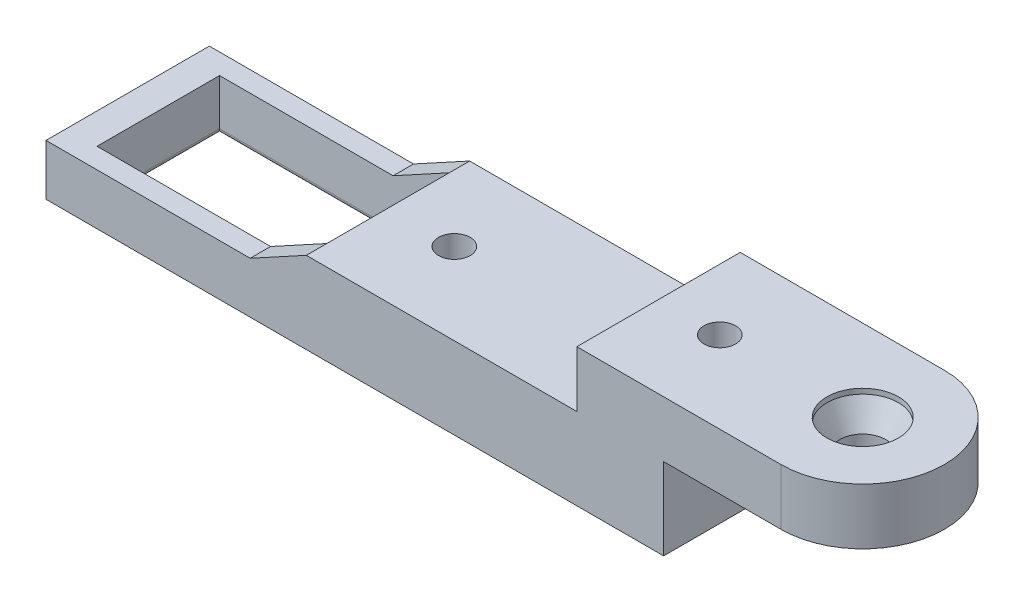
ISO-10303-21;
HEADER;
FILE_DESCRIPTION(('STEP AP214'),'2;1');
FILE_NAME('part.step','',(''),(''),'','','');
FILE_SCHEMA(('AUTOMOTIVE_DESIGN { 1 0 10303 214 1 1 1 1 }'));
ENDSEC;
DATA;
#1=APPLICATION_CONTEXT('core data for automotive mechanical design processes');
#2=APPLICATION_PROTOCOL_DEFINITION('international standard','automotive_design',2000,#1);
#3=PRODUCT_CONTEXT('',#1,'mechanical');
#4=PRODUCT('Part','Part','',(#3));
#5=PRODUCT_RELATED_PRODUCT_CATEGORY('part','',(#4));
#6=PRODUCT_DEFINITION_FORMATION('','',#4);
#7=PRODUCT_DEFINITION_CONTEXT('part definition',#1,'design');
#8=PRODUCT_DEFINITION('design','',#6,#7);
#9=PRODUCT_DEFINITION_SHAPE('','',#8);
#10=(LENGTH_UNIT() NAMED_UNIT(*) SI_UNIT(.MILLI.,.METRE.));
#11=(NAMED_UNIT(*) PLANE_ANGLE_UNIT() SI_UNIT($,.RADIAN.));
#12=(NAMED_UNIT(*) SI_UNIT($,.STERADIAN.) SOLID_ANGLE_UNIT());
#13=UNCERTAINTY_MEASURE_WITH_UNIT(LENGTH_MEASURE(1.E-05),#10,'distance_accuracy_value','');
#14=(GEOMETRIC_REPRESENTATION_CONTEXT(3) GLOBAL_UNCERTAINTY_ASSIGNED_CONTEXT((#13)) GLOBAL_UNIT_ASSIGNED_CONTEXT((#10,
#11,#12)) REPRESENTATION_CONTEXT('',''));
#15=CARTESIAN_POINT('',(0.,0.,0.));
#16=DIRECTION('',(0.,0.,1.));
#17=DIRECTION('',(1.,0.,0.));
#18=AXIS2_PLACEMENT_3D('',#15,#16,#17);
#19=CARTESIAN_POINT('',(57.75,0.,0.));
#20=DIRECTION('',(0.,1.,0.));
#21=DIRECTION('',(0.,0.,1.));
#22=AXIS2_PLACEMENT_3D('',#19,#20,#21);
#23=CYLINDRICAL_SURFACE('',#22,2.25);
#24=CARTESIAN_POINT('',(57.75,8.,0.));
#25=DIRECTION('',(0.,1.,0.));
#26=DIRECTION('',(0.,0.,1.));
#27=AXIS2_PLACEMENT_3D('',#24,#25,#26);
#28=CIRCLE('',#27,2.25);
#29=CARTESIAN_POINT('',(57.75,8.,2.25));
#30=VERTEX_POINT('',#29);
#31=EDGE_CURVE('E228',#30,#30,#28,.T.);
#32=ORIENTED_EDGE('',*,*,#31,.F.);
#33=EDGE_LOOP('',(#32));
#34=FACE_BOUND('',#33,.T.);
#35=CARTESIAN_POINT('',(57.75,10.5,0.));
#36=DIRECTION('',(0.,1.,0.));
#37=DIRECTION('',(0.,0.,1.));
#38=AXIS2_PLACEMENT_3D('',#35,#36,#37);
#39=CIRCLE('',#38,2.25);
#40=CARTESIAN_POINT('',(57.75,10.5,2.25));
#41=VERTEX_POINT('',#40);
#42=EDGE_CURVE('E238',#41,#41,#39,.F.);
#43=ORIENTED_EDGE('',*,*,#42,.F.);
#44=EDGE_LOOP('',(#43));
#45=FACE_BOUND('',#44,.T.);
#46=ADVANCED_FACE('F35',(#34,#45),#23,.F.);
#47=CARTESIAN_POINT('',(-14.25,5.,8.));
#48=DIRECTION('',(0.,0.,-1.));
#49=DIRECTION('',(-1.,0.,0.));
#50=AXIS2_PLACEMENT_3D('',#47,#48,#49);
#51=PLANE('',#50);
#52=DIRECTION('',(1.,0.,0.));
#53=VECTOR('',#52,1.);
#54=CARTESIAN_POINT('',(5.75,8.,8.));
#55=LINE('',#54,#53);
#56=CARTESIAN_POINT('',(11.25,8.,8.));
#57=VERTEX_POINT('',#56);
#58=CARTESIAN_POINT('',(37.75,8.,8.));
#59=VERTEX_POINT('',#58);
#60=EDGE_CURVE('E316',#57,#59,#55,.T.);
#61=ORIENTED_EDGE('',*,*,#60,.F.);
#62=DIRECTION('',(-0.877895572914385,-0.478852130680572,0.));
#63=VECTOR('',#62,1.);
#64=CARTESIAN_POINT('',(11.25,7.99999999999999,8.));
#65=LINE('',#64,#63);
#66=CARTESIAN_POINT('',(5.75,5.,8.));
#67=VERTEX_POINT('',#66);
#68=EDGE_CURVE('E51',#57,#67,#65,.T.);
#69=ORIENTED_EDGE('',*,*,#68,.T.);
#70=DIRECTION('',(1.,0.,0.));
#71=VECTOR('',#70,1.);
#72=CARTESIAN_POINT('',(-14.25,5.,8.));
#73=LINE('',#72,#71);
#74=CARTESIAN_POINT('',(-14.25,5.,8.));
#75=VERTEX_POINT('',#74);
#76=EDGE_CURVE('E194',#75,#67,#73,.T.);
#77=ORIENTED_EDGE('',*,*,#76,.F.);
#78=DIRECTION('',(0.,-1.,0.));
#79=VECTOR('',#78,1.);
#80=CARTESIAN_POINT('',(-14.25,5.,8.));
#81=LINE('',#80,#79);
#82=CARTESIAN_POINT('',(-14.25,0.,8.));
#83=VERTEX_POINT('',#82);
#84=EDGE_CURVE('E183',#75,#83,#81,.T.);
#85=ORIENTED_EDGE('',*,*,#84,.T.);
#86=DIRECTION('',(1.,0.,0.));
#87=VECTOR('',#86,1.);
#88=CARTESIAN_POINT('',(-14.25,0.,8.));
#89=LINE('',#88,#87);
#90=CARTESIAN_POINT('',(46.25,0.,8.));
#91=VERTEX_POINT('',#90);
#92=EDGE_CURVE('E175',#83,#91,#89,.T.);
#93=ORIENTED_EDGE('',*,*,#92,.T.);
#94=DIRECTION('',(0.,1.,0.));
#95=VECTOR('',#94,1.);
#96=CARTESIAN_POINT('',(46.25,8.,8.));
#97=LINE('',#96,#95);
#98=CARTESIAN_POINT('',(46.25,8.,8.));
#99=VERTEX_POINT('',#98);
#100=EDGE_CURVE('E156',#91,#99,#97,.T.);
#101=ORIENTED_EDGE('',*,*,#100,.T.);
#102=DIRECTION('',(-1.,0.,0.));
#103=VECTOR('',#102,1.);
#104=CARTESIAN_POINT('',(67.75,8.,8.));
#105=LINE('',#104,#103);
#106=CARTESIAN_POINT('',(57.75,8.,8.));
#107=VERTEX_POINT('',#106);
#108=EDGE_CURVE('E340',#107,#99,#105,.T.);
#109=ORIENTED_EDGE('',*,*,#108,.F.);
#110=DIRECTION('',(0.,1.,0.));
#111=VECTOR('',#110,1.);
#112=CARTESIAN_POINT('',(57.75,0.,8.));
#113=LINE('',#112,#111);
#114=CARTESIAN_POINT('',(57.75,13.5,8.));
#115=VERTEX_POINT('',#114);
#116=EDGE_CURVE('E232',#107,#115,#113,.T.);
#117=ORIENTED_EDGE('',*,*,#116,.T.);
#118=DIRECTION('',(1.,0.,0.));
#119=VECTOR('',#118,1.);
#120=CARTESIAN_POINT('',(47.75,13.5,8.));
#121=LINE('',#120,#119);
#122=CARTESIAN_POINT('',(37.75,13.5,8.));
#123=VERTEX_POINT('',#122);
#124=EDGE_CURVE('E326',#123,#115,#121,.T.);
#125=ORIENTED_EDGE('',*,*,#124,.F.);
#126=DIRECTION('',(0.,-1.,0.));
#127=VECTOR('',#126,1.);
#128=CARTESIAN_POINT('',(37.75,13.5,8.));
#129=LINE('',#128,#127);
#130=EDGE_CURVE('E323',#123,#59,#129,.T.);
#131=ORIENTED_EDGE('',*,*,#130,.T.);
#132=EDGE_LOOP('',(#61,#69,#77,#85,#93,#101,#109,#117,#125,#131));
#133=FACE_BOUND('',#132,.T.);
#134=ADVANCED_FACE('F180',(#133),#51,.F.);
#135=CARTESIAN_POINT('',(0.,5.,0.));
#136=DIRECTION('',(0.,-1.,0.));
#137=DIRECTION('',(0.,0.,-1.));
#138=AXIS2_PLACEMENT_3D('',#135,#136,#137);
#139=PLANE('',#138);
#140=DIRECTION('',(0.,0.,1.));
#141=VECTOR('',#140,1.);
#142=CARTESIAN_POINT('',(5.75,5.,-8.));
#143=LINE('',#142,#141);
#144=CARTESIAN_POINT('',(5.75,5.,-8.));
#145=VERTEX_POINT('',#144);
#146=CARTESIAN_POINT('',(5.74999999999999,5.,-6.));
#147=VERTEX_POINT('',#146);
#148=EDGE_CURVE('E268',#145,#147,#143,.T.);
#149=ORIENTED_EDGE('',*,*,#148,.F.);
#150=DIRECTION('',(-1.,0.,0.));
#151=VECTOR('',#150,1.);
#152=CARTESIAN_POINT('',(-14.25,5.,-8.));
#153=LINE('',#152,#151);
#154=CARTESIAN_POINT('',(-14.25,5.,-8.));
#155=VERTEX_POINT('',#154);
#156=EDGE_CURVE('E184',#145,#155,#153,.T.);
#157=ORIENTED_EDGE('',*,*,#156,.T.);
#158=DIRECTION('',(0.,0.,1.));
#159=VECTOR('',#158,1.);
#160=CARTESIAN_POINT('',(-14.25,5.,-8.));
#161=LINE('',#160,#159);
#162=EDGE_CURVE('E187',#155,#75,#161,.T.);
#163=ORIENTED_EDGE('',*,*,#162,.T.);
#164=ORIENTED_EDGE('',*,*,#76,.T.);
#165=DIRECTION('',(0.,0.,1.));
#166=VECTOR('',#165,1.);
#167=CARTESIAN_POINT('',(5.75,5.,6.));
#168=LINE('',#167,#166);
#169=CARTESIAN_POINT('',(5.74999999999999,5.,6.));
#170=VERTEX_POINT('',#169);
#171=EDGE_CURVE('E274',#170,#67,#168,.T.);
#172=ORIENTED_EDGE('',*,*,#171,.F.);
#173=DIRECTION('',(1.,0.,0.));
#174=VECTOR('',#173,1.);
#175=CARTESIAN_POINT('',(-11.25,5.,6.));
#176=LINE('',#175,#174);
#177=CARTESIAN_POINT('',(-11.25,5.,6.));
#178=VERTEX_POINT('',#177);
#179=EDGE_CURVE('E285',#178,#170,#176,.T.);
#180=ORIENTED_EDGE('',*,*,#179,.F.);
#181=DIRECTION('',(0.,0.,1.));
#182=VECTOR('',#181,1.);
#183=CARTESIAN_POINT('',(-11.25,5.,6.));
#184=LINE('',#183,#182);
#185=CARTESIAN_POINT('',(-11.25,5.,-6.));
#186=VERTEX_POINT('',#185);
#187=EDGE_CURVE('E271',#186,#178,#184,.T.);
#188=ORIENTED_EDGE('',*,*,#187,.F.);
#189=DIRECTION('',(-1.,0.,0.));
#190=VECTOR('',#189,1.);
#191=CARTESIAN_POINT('',(-11.25,5.,-6.));
#192=LINE('',#191,#190);
#193=EDGE_CURVE('E257',#147,#186,#192,.T.);
#194=ORIENTED_EDGE('',*,*,#193,.F.);
#195=EDGE_LOOP('',(#149,#157,#163,#164,#172,#180,#188,#194));
#196=FACE_BOUND('',#195,.T.);
#197=ADVANCED_FACE('F267',(#196),#139,.F.);
#198=CARTESIAN_POINT('',(0.,0.,0.));
#199=DIRECTION('',(0.,-1.,0.));
#200=DIRECTION('',(0.,0.,-1.));
#201=AXIS2_PLACEMENT_3D('',#198,#199,#200);
#202=PLANE('',#201);
#203=DIRECTION('',(0.,0.,-1.));
#204=VECTOR('',#203,1.);
#205=CARTESIAN_POINT('',(46.25,0.,8.));
#206=LINE('',#205,#204);
#207=CARTESIAN_POINT('',(46.25,0.,-8.));
#208=VERTEX_POINT('',#207);
#209=EDGE_CURVE('E160',#91,#208,#206,.T.);
#210=ORIENTED_EDGE('',*,*,#209,.F.);
#211=ORIENTED_EDGE('',*,*,#92,.F.);
#212=DIRECTION('',(0.,0.,1.));
#213=VECTOR('',#212,1.);
#214=CARTESIAN_POINT('',(-14.25,0.,-8.));
#215=LINE('',#214,#213);
#216=CARTESIAN_POINT('',(-14.25,0.,-8.));
#217=VERTEX_POINT('',#216);
#218=EDGE_CURVE('E185',#217,#83,#215,.T.);
#219=ORIENTED_EDGE('',*,*,#218,.F.);
#220=DIRECTION('',(-1.,0.,0.));
#221=VECTOR('',#220,1.);
#222=CARTESIAN_POINT('',(-14.25,0.,-8.));
#223=LINE('',#222,#221);
#224=EDGE_CURVE('E176',#208,#217,#223,.T.);
#225=ORIENTED_EDGE('',*,*,#224,.F.);
#226=EDGE_LOOP('',(#210,#211,#219,#225));
#227=FACE_BOUND('',#226,.T.);
#228=DIRECTION('',(1.,0.,0.));
#229=VECTOR('',#228,1.);
#230=CARTESIAN_POINT('',(0.,0.,6.5));
#231=LINE('',#230,#229);
#232=CARTESIAN_POINT('',(-11.75,0.,6.5));
#233=VERTEX_POINT('',#232);
#234=CARTESIAN_POINT('',(11.75,0.,6.5));
#235=VERTEX_POINT('',#234);
#236=EDGE_CURVE('E197',#233,#235,#231,.T.);
#237=ORIENTED_EDGE('',*,*,#236,.T.);
#238=DIRECTION('',(0.,0.,-1.));
#239=VECTOR('',#238,1.);
#240=CARTESIAN_POINT('',(11.75,0.,0.));
#241=LINE('',#240,#239);
#242=CARTESIAN_POINT('',(11.75,0.,-6.5));
#243=VERTEX_POINT('',#242);
#244=EDGE_CURVE('E203',#235,#243,#241,.T.);
#245=ORIENTED_EDGE('',*,*,#244,.T.);
#246=DIRECTION('',(-1.,0.,0.));
#247=VECTOR('',#246,1.);
#248=CARTESIAN_POINT('',(0.,0.,-6.5));
#249=LINE('',#248,#247);
#250=CARTESIAN_POINT('',(-11.75,0.,-6.5));
#251=VERTEX_POINT('',#250);
#252=EDGE_CURVE('E201',#243,#251,#249,.T.);
#253=ORIENTED_EDGE('',*,*,#252,.T.);
#254=DIRECTION('',(0.,0.,1.));
#255=VECTOR('',#254,1.);
#256=CARTESIAN_POINT('',(-11.75,0.,0.));
#257=LINE('',#256,#255);
#258=EDGE_CURVE('E199',#251,#233,#257,.T.);
#259=ORIENTED_EDGE('',*,*,#258,.T.);
#260=EDGE_LOOP('',(#237,#245,#253,#259));
#261=FACE_BOUND('',#260,.T.);
#262=ADVANCED_FACE('F172',(#227,#261),#202,.T.);
#263=CARTESIAN_POINT('',(-14.25,5.,-8.));
#264=DIRECTION('',(0.,0.,1.));
#265=DIRECTION('',(1.,0.,0.));
#266=AXIS2_PLACEMENT_3D('',#263,#264,#265);
#267=PLANE('',#266);
#268=ORIENTED_EDGE('',*,*,#156,.F.);
#269=DIRECTION('',(0.877895572914385,0.478852130680572,0.));
#270=VECTOR('',#269,1.);
#271=CARTESIAN_POINT('',(11.25,8.,-8.));
#272=LINE('',#271,#270);
#273=CARTESIAN_POINT('',(11.25,8.,-8.));
#274=VERTEX_POINT('',#273);
#275=EDGE_CURVE('E11',#145,#274,#272,.T.);
#276=ORIENTED_EDGE('',*,*,#275,.T.);
#277=DIRECTION('',(-1.,0.,0.));
#278=VECTOR('',#277,1.);
#279=CARTESIAN_POINT('',(22.,8.,-8.));
#280=LINE('',#279,#278);
#281=CARTESIAN_POINT('',(37.75,8.,-8.));
#282=VERTEX_POINT('',#281);
#283=EDGE_CURVE('E272',#282,#274,#280,.T.);
#284=ORIENTED_EDGE('',*,*,#283,.F.);
#285=DIRECTION('',(0.,-1.,0.));
#286=VECTOR('',#285,1.);
#287=CARTESIAN_POINT('',(37.75,13.5,-8.));
#288=LINE('',#287,#286);
#289=CARTESIAN_POINT('',(37.75,13.5,-8.));
#290=VERTEX_POINT('',#289);
#291=EDGE_CURVE('E219',#290,#282,#288,.T.);
#292=ORIENTED_EDGE('',*,*,#291,.F.);
#293=DIRECTION('',(-1.,0.,0.));
#294=VECTOR('',#293,1.);
#295=CARTESIAN_POINT('',(47.75,13.5,-8.));
#296=LINE('',#295,#294);
#297=CARTESIAN_POINT('',(57.75,13.5,-8.));
#298=VERTEX_POINT('',#297);
#299=EDGE_CURVE('E330',#298,#290,#296,.T.);
#300=ORIENTED_EDGE('',*,*,#299,.F.);
#301=DIRECTION('',(0.,1.,0.));
#302=VECTOR('',#301,1.);
#303=CARTESIAN_POINT('',(57.75,0.,-8.));
#304=LINE('',#303,#302);
#305=CARTESIAN_POINT('',(57.75,8.,-8.));
#306=VERTEX_POINT('',#305);
#307=EDGE_CURVE('E241',#306,#298,#304,.T.);
#308=ORIENTED_EDGE('',*,*,#307,.F.);
#309=DIRECTION('',(-1.,0.,0.));
#310=VECTOR('',#309,1.);
#311=CARTESIAN_POINT('',(67.75,8.,-8.));
#312=LINE('',#311,#310);
#313=CARTESIAN_POINT('',(46.25,8.,-8.));
#314=VERTEX_POINT('',#313);
#315=EDGE_CURVE('E237',#306,#314,#312,.T.);
#316=ORIENTED_EDGE('',*,*,#315,.T.);
#317=DIRECTION('',(0.,1.,0.));
#318=VECTOR('',#317,1.);
#319=CARTESIAN_POINT('',(46.25,8.,-8.));
#320=LINE('',#319,#318);
#321=EDGE_CURVE('E167',#208,#314,#320,.T.);
#322=ORIENTED_EDGE('',*,*,#321,.F.);
#323=ORIENTED_EDGE('',*,*,#224,.T.);
#324=DIRECTION('',(0.,-1.,0.));
#325=VECTOR('',#324,1.);
#326=CARTESIAN_POINT('',(-14.25,5.,-8.));
#327=LINE('',#326,#325);
#328=EDGE_CURVE('E193',#155,#217,#327,.T.);
#329=ORIENTED_EDGE('',*,*,#328,.F.);
#330=EDGE_LOOP('',(#268,#276,#284,#292,#300,#308,#316,#322,#323,#329));
#331=FACE_BOUND('',#330,.T.);
#332=ADVANCED_FACE('F300',(#331),#267,.F.);
#333=CARTESIAN_POINT('',(-14.25,5.,-8.));
#334=DIRECTION('',(1.,0.,0.));
#335=DIRECTION('',(0.,0.,-1.));
#336=AXIS2_PLACEMENT_3D('',#333,#334,#335);
#337=PLANE('',#336);
#338=ORIENTED_EDGE('',*,*,#218,.T.);
#339=ORIENTED_EDGE('',*,*,#84,.F.);
#340=ORIENTED_EDGE('',*,*,#162,.F.);
#341=ORIENTED_EDGE('',*,*,#328,.T.);
#342=EDGE_LOOP('',(#338,#339,#340,#341));
#343=FACE_BOUND('',#342,.T.);
#344=ADVANCED_FACE('F303',(#343),#337,.F.);
#345=CARTESIAN_POINT('',(11.25,5.,6.));
#346=DIRECTION('',(-1.,0.,0.));
#347=DIRECTION('',(0.,0.,1.));
#348=AXIS2_PLACEMENT_3D('',#345,#346,#347);
#349=PLANE('',#348);
#350=DIRECTION('',(0.,-1.,0.));
#351=VECTOR('',#350,1.);
#352=CARTESIAN_POINT('',(11.25,5.,-6.));
#353=LINE('',#352,#351);
#354=CARTESIAN_POINT('',(11.25,8.,-6.));
#355=VERTEX_POINT('',#354);
#356=CARTESIAN_POINT('',(11.25,0.5,-6.));
#357=VERTEX_POINT('',#356);
#358=EDGE_CURVE('E260',#355,#357,#353,.T.);
#359=ORIENTED_EDGE('',*,*,#358,.T.);
#360=DIRECTION('',(0.,0.,-1.));
#361=VECTOR('',#360,1.);
#362=CARTESIAN_POINT('',(11.25,0.5,6.));
#363=LINE('',#362,#361);
#364=CARTESIAN_POINT('',(11.25,0.5,6.));
#365=VERTEX_POINT('',#364);
#366=EDGE_CURVE('E206',#357,#365,#363,.F.);
#367=ORIENTED_EDGE('',*,*,#366,.T.);
#368=DIRECTION('',(0.,-1.,0.));
#369=VECTOR('',#368,1.);
#370=CARTESIAN_POINT('',(11.25,5.,6.));
#371=LINE('',#370,#369);
#372=CARTESIAN_POINT('',(11.25,8.,6.));
#373=VERTEX_POINT('',#372);
#374=EDGE_CURVE('E288',#373,#365,#371,.T.);
#375=ORIENTED_EDGE('',*,*,#374,.F.);
#376=DIRECTION('',(0.,0.,1.));
#377=VECTOR('',#376,1.);
#378=CARTESIAN_POINT('',(11.25,8.,-6.));
#379=LINE('',#378,#377);
#380=EDGE_CURVE('E277',#355,#373,#379,.T.);
#381=ORIENTED_EDGE('',*,*,#380,.F.);
#382=EDGE_LOOP('',(#359,#367,#375,#381));
#383=FACE_BOUND('',#382,.T.);
#384=ADVANCED_FACE('F311',(#383),#349,.T.);
#385=CARTESIAN_POINT('',(-11.25,5.,-6.));
#386=DIRECTION('',(0.,0.,1.));
#387=DIRECTION('',(1.,0.,0.));
#388=AXIS2_PLACEMENT_3D('',#385,#386,#387);
#389=PLANE('',#388);
#390=ORIENTED_EDGE('',*,*,#358,.F.);
#391=DIRECTION('',(-0.877895572914385,-0.478852130680572,0.));
#392=VECTOR('',#391,1.);
#393=CARTESIAN_POINT('',(-7.35191082802549,-2.14649681528662,-6.));
#394=LINE('',#393,#392);
#395=EDGE_CURVE('E44',#355,#147,#394,.T.);
#396=ORIENTED_EDGE('',*,*,#395,.T.);
#397=ORIENTED_EDGE('',*,*,#193,.T.);
#398=DIRECTION('',(0.,-1.,0.));
#399=VECTOR('',#398,1.);
#400=CARTESIAN_POINT('',(-11.25,5.,-6.));
#401=LINE('',#400,#399);
#402=CARTESIAN_POINT('',(-11.25,0.5,-6.));
#403=VERTEX_POINT('',#402);
#404=EDGE_CURVE('E294',#186,#403,#401,.T.);
#405=ORIENTED_EDGE('',*,*,#404,.T.);
#406=DIRECTION('',(-1.,0.,0.));
#407=VECTOR('',#406,1.);
#408=CARTESIAN_POINT('',(-11.25,0.5,-6.));
#409=LINE('',#408,#407);
#410=EDGE_CURVE('E209',#403,#357,#409,.F.);
#411=ORIENTED_EDGE('',*,*,#410,.T.);
#412=EDGE_LOOP('',(#390,#396,#397,#405,#411));
#413=FACE_BOUND('',#412,.T.);
#414=ADVANCED_FACE('F255',(#413),#389,.T.);
#415=CARTESIAN_POINT('',(-11.25,5.,6.));
#416=DIRECTION('',(1.,0.,0.));
#417=DIRECTION('',(0.,0.,-1.));
#418=AXIS2_PLACEMENT_3D('',#415,#416,#417);
#419=PLANE('',#418);
#420=DIRECTION('',(0.,-1.,0.));
#421=VECTOR('',#420,1.);
#422=CARTESIAN_POINT('',(-11.25,5.,6.));
#423=LINE('',#422,#421);
#424=CARTESIAN_POINT('',(-11.25,0.5,6.));
#425=VERTEX_POINT('',#424);
#426=EDGE_CURVE('E291',#178,#425,#423,.T.);
#427=ORIENTED_EDGE('',*,*,#426,.T.);
#428=DIRECTION('',(0.,0.,1.));
#429=VECTOR('',#428,1.);
#430=CARTESIAN_POINT('',(-11.25,0.5,6.));
#431=LINE('',#430,#429);
#432=EDGE_CURVE('E211',#425,#403,#431,.F.);
#433=ORIENTED_EDGE('',*,*,#432,.T.);
#434=ORIENTED_EDGE('',*,*,#404,.F.);
#435=ORIENTED_EDGE('',*,*,#187,.T.);
#436=EDGE_LOOP('',(#427,#433,#434,#435));
#437=FACE_BOUND('',#436,.T.);
#438=ADVANCED_FACE('F415',(#437),#419,.T.);
#439=CARTESIAN_POINT('',(-11.25,5.,6.));
#440=DIRECTION('',(0.,0.,-1.));
#441=DIRECTION('',(-1.,0.,0.));
#442=AXIS2_PLACEMENT_3D('',#439,#440,#441);
#443=PLANE('',#442);
#444=ORIENTED_EDGE('',*,*,#179,.T.);
#445=DIRECTION('',(0.877895572914385,0.478852130680572,0.));
#446=VECTOR('',#445,1.);
#447=CARTESIAN_POINT('',(-7.35191082802549,-2.14649681528662,6.));
#448=LINE('',#447,#446);
#449=EDGE_CURVE('E251',#170,#373,#448,.T.);
#450=ORIENTED_EDGE('',*,*,#449,.T.);
#451=ORIENTED_EDGE('',*,*,#374,.T.);
#452=DIRECTION('',(1.,0.,0.));
#453=VECTOR('',#452,1.);
#454=CARTESIAN_POINT('',(-11.25,0.5,6.));
#455=LINE('',#454,#453);
#456=EDGE_CURVE('E213',#365,#425,#455,.F.);
#457=ORIENTED_EDGE('',*,*,#456,.T.);
#458=ORIENTED_EDGE('',*,*,#426,.F.);
#459=EDGE_LOOP('',(#444,#450,#451,#457,#458));
#460=FACE_BOUND('',#459,.T.);
#461=ADVANCED_FACE('F308',(#460),#443,.T.);
#462=CARTESIAN_POINT('',(0.,8.,0.));
#463=DIRECTION('',(0.,1.,0.));
#464=DIRECTION('',(0.,0.,1.));
#465=AXIS2_PLACEMENT_3D('',#462,#463,#464);
#466=PLANE('',#465);
#467=ORIENTED_EDGE('',*,*,#380,.T.);
#468=DIRECTION('',(0.,0.,1.));
#469=VECTOR('',#468,1.);
#470=CARTESIAN_POINT('',(11.25,8.,7.99999999999999));
#471=LINE('',#470,#469);
#472=EDGE_CURVE('E248',#373,#57,#471,.T.);
#473=ORIENTED_EDGE('',*,*,#472,.T.);
#474=ORIENTED_EDGE('',*,*,#60,.T.);
#475=DIRECTION('',(0.,0.,1.));
#476=VECTOR('',#475,1.);
#477=CARTESIAN_POINT('',(37.75,8.,-8.));
#478=LINE('',#477,#476);
#479=EDGE_CURVE('E327',#282,#59,#478,.T.);
#480=ORIENTED_EDGE('',*,*,#479,.F.);
#481=ORIENTED_EDGE('',*,*,#283,.T.);
#482=DIRECTION('',(0.,0.,1.));
#483=VECTOR('',#482,1.);
#484=CARTESIAN_POINT('',(11.25,8.,-6.00000000000001));
#485=LINE('',#484,#483);
#486=EDGE_CURVE('E245',#274,#355,#485,.T.);
#487=ORIENTED_EDGE('',*,*,#486,.T.);
#488=EDGE_LOOP('',(#467,#473,#474,#480,#481,#487));
#489=FACE_BOUND('',#488,.T.);
#490=CARTESIAN_POINT('',(17.75,8.,0.));
#491=DIRECTION('',(0.,1.,0.));
#492=DIRECTION('',(0.,0.,1.));
#493=AXIS2_PLACEMENT_3D('',#490,#491,#492);
#494=CIRCLE('',#493,1.55);
#495=CARTESIAN_POINT('',(17.75,8.,1.55));
#496=VERTEX_POINT('',#495);
#497=EDGE_CURVE('E227',#496,#496,#494,.T.);
#498=ORIENTED_EDGE('',*,*,#497,.F.);
#499=EDGE_LOOP('',(#498));
#500=FACE_BOUND('',#499,.T.);
#501=ADVANCED_FACE('F314',(#489,#500),#466,.T.);
#502=CARTESIAN_POINT('',(17.75,4.5,0.));
#503=DIRECTION('',(0.,1.,0.));
#504=DIRECTION('',(0.,0.,1.));
#505=AXIS2_PLACEMENT_3D('',#502,#503,#504);
#506=CYLINDRICAL_SURFACE('',#505,1.55);
#507=CARTESIAN_POINT('',(17.75,4.5,0.));
#508=DIRECTION('',(0.,1.,0.));
#509=DIRECTION('',(0.,0.,1.));
#510=AXIS2_PLACEMENT_3D('',#507,#508,#509);
#511=CIRCLE('',#510,1.55);
#512=CARTESIAN_POINT('',(17.75,4.5,1.55));
#513=VERTEX_POINT('',#512);
#514=EDGE_CURVE('E275',#513,#513,#511,.T.);
#515=ORIENTED_EDGE('',*,*,#514,.F.);
#516=EDGE_LOOP('',(#515));
#517=FACE_BOUND('',#516,.T.);
#518=ORIENTED_EDGE('',*,*,#497,.T.);
#519=EDGE_LOOP('',(#518));
#520=FACE_BOUND('',#519,.T.);
#521=ADVANCED_FACE('F406',(#517,#520),#506,.F.);
#522=CARTESIAN_POINT('',(17.75,4.5,0.));
#523=DIRECTION('',(0.,1.,0.));
#524=DIRECTION('',(0.,0.,1.));
#525=AXIS2_PLACEMENT_3D('',#522,#523,#524);
#526=PLANE('',#525);
#527=ORIENTED_EDGE('',*,*,#514,.T.);
#528=EDGE_LOOP('',(#527));
#529=FACE_BOUND('',#528,.T.);
#530=ADVANCED_FACE('F402',(#529),#526,.T.);
#531=CARTESIAN_POINT('',(-11.75,0.5,0.));
#532=DIRECTION('',(0.,0.,1.));
#533=DIRECTION('',(1.,0.,0.));
#534=AXIS2_PLACEMENT_3D('',#531,#532,#533);
#535=CYLINDRICAL_SURFACE('',#534,0.5);
#536=CARTESIAN_POINT('',(-11.75,0.5,-6.5));
#537=DIRECTION('',(-0.707106781186547,0.,0.707106781186547));
#538=DIRECTION('',(-0.707106781186547,0.,-0.707106781186547));
#539=AXIS2_PLACEMENT_3D('',#536,#537,#538);
#540=ELLIPSE('',#539,0.707106781186547,0.5);
#541=EDGE_CURVE('E221',#403,#251,#540,.F.);
#542=ORIENTED_EDGE('',*,*,#541,.F.);
#543=ORIENTED_EDGE('',*,*,#432,.F.);
#544=CARTESIAN_POINT('',(-11.75,0.5,6.5));
#545=DIRECTION('',(0.707106781186547,0.,0.707106781186547));
#546=DIRECTION('',(-0.707106781186547,0.,0.707106781186547));
#547=AXIS2_PLACEMENT_3D('',#544,#545,#546);
#548=ELLIPSE('',#547,0.707106781186547,0.5);
#549=EDGE_CURVE('E224',#233,#425,#548,.T.);
#550=ORIENTED_EDGE('',*,*,#549,.F.);
#551=ORIENTED_EDGE('',*,*,#258,.F.);
#552=EDGE_LOOP('',(#542,#543,#550,#551));
#553=FACE_BOUND('',#552,.T.);
#554=ADVANCED_FACE('F405',(#553),#535,.T.);
#555=CARTESIAN_POINT('',(0.,0.5,6.5));
#556=DIRECTION('',(1.,0.,0.));
#557=DIRECTION('',(0.,0.,-1.));
#558=AXIS2_PLACEMENT_3D('',#555,#556,#557);
#559=CYLINDRICAL_SURFACE('',#558,0.5);
#560=ORIENTED_EDGE('',*,*,#549,.T.);
#561=ORIENTED_EDGE('',*,*,#456,.F.);
#562=CARTESIAN_POINT('',(11.75,0.5,6.5));
#563=DIRECTION('',(0.707106781186547,0.,-0.707106781186547));
#564=DIRECTION('',(-0.707106781186547,0.,-0.707106781186547));
#565=AXIS2_PLACEMENT_3D('',#562,#563,#564);
#566=ELLIPSE('',#565,0.707106781186547,0.5);
#567=EDGE_CURVE('E218',#235,#365,#566,.T.);
#568=ORIENTED_EDGE('',*,*,#567,.F.);
#569=ORIENTED_EDGE('',*,*,#236,.F.);
#570=EDGE_LOOP('',(#560,#561,#568,#569));
#571=FACE_BOUND('',#570,.T.);
#572=ADVANCED_FACE('F437',(#571),#559,.T.);
#573=CARTESIAN_POINT('',(0.,0.5,-6.5));
#574=DIRECTION('',(-1.,0.,0.));
#575=DIRECTION('',(0.,0.,1.));
#576=AXIS2_PLACEMENT_3D('',#573,#574,#575);
#577=CYLINDRICAL_SURFACE('',#576,0.5);
#578=ORIENTED_EDGE('',*,*,#541,.T.);
#579=ORIENTED_EDGE('',*,*,#252,.F.);
#580=CARTESIAN_POINT('',(11.75,0.5,-6.5));
#581=DIRECTION('',(-0.707106781186547,0.,-0.707106781186547));
#582=DIRECTION('',(0.707106781186547,0.,-0.707106781186547));
#583=AXIS2_PLACEMENT_3D('',#580,#581,#582);
#584=ELLIPSE('',#583,0.707106781186547,0.5);
#585=EDGE_CURVE('E216',#357,#243,#584,.F.);
#586=ORIENTED_EDGE('',*,*,#585,.F.);
#587=ORIENTED_EDGE('',*,*,#410,.F.);
#588=EDGE_LOOP('',(#578,#579,#586,#587));
#589=FACE_BOUND('',#588,.T.);
#590=ADVANCED_FACE('F433',(#589),#577,.T.);
#591=CARTESIAN_POINT('',(11.75,0.5,0.));
#592=DIRECTION('',(0.,0.,-1.));
#593=DIRECTION('',(-1.,0.,0.));
#594=AXIS2_PLACEMENT_3D('',#591,#592,#593);
#595=CYLINDRICAL_SURFACE('',#594,0.5);
#596=ORIENTED_EDGE('',*,*,#567,.T.);
#597=ORIENTED_EDGE('',*,*,#366,.F.);
#598=ORIENTED_EDGE('',*,*,#585,.T.);
#599=ORIENTED_EDGE('',*,*,#244,.F.);
#600=EDGE_LOOP('',(#596,#597,#598,#599));
#601=FACE_BOUND('',#600,.T.);
#602=ADVANCED_FACE('F401',(#601),#595,.T.);
#603=CARTESIAN_POINT('',(37.75,13.5,-8.));
#604=DIRECTION('',(1.,0.,0.));
#605=DIRECTION('',(0.,0.,-1.));
#606=AXIS2_PLACEMENT_3D('',#603,#604,#605);
#607=PLANE('',#606);
#608=ORIENTED_EDGE('',*,*,#479,.T.);
#609=ORIENTED_EDGE('',*,*,#130,.F.);
#610=DIRECTION('',(0.,0.,1.));
#611=VECTOR('',#610,1.);
#612=CARTESIAN_POINT('',(37.75,13.5,-8.));
#613=LINE('',#612,#611);
#614=EDGE_CURVE('E334',#290,#123,#613,.T.);
#615=ORIENTED_EDGE('',*,*,#614,.F.);
#616=ORIENTED_EDGE('',*,*,#291,.T.);
#617=EDGE_LOOP('',(#608,#609,#615,#616));
#618=FACE_BOUND('',#617,.T.);
#619=ADVANCED_FACE('F364',(#618),#607,.F.);
#620=CARTESIAN_POINT('',(0.,13.5,0.));
#621=DIRECTION('',(0.,-1.,0.));
#622=DIRECTION('',(0.,0.,-1.));
#623=AXIS2_PLACEMENT_3D('',#620,#621,#622);
#624=PLANE('',#623);
#625=CARTESIAN_POINT('',(57.75,13.5,0.));
#626=DIRECTION('',(0.,1.,0.));
#627=DIRECTION('',(0.,0.,1.));
#628=AXIS2_PLACEMENT_3D('',#625,#626,#627);
#629=CIRCLE('',#628,3.5);
#630=CARTESIAN_POINT('',(57.75,13.5,3.5));
#631=VERTEX_POINT('',#630);
#632=EDGE_CURVE('E242',#631,#631,#629,.T.);
#633=ORIENTED_EDGE('',*,*,#632,.F.);
#634=EDGE_LOOP('',(#633));
#635=FACE_BOUND('',#634,.T.);
#636=CARTESIAN_POINT('',(43.75,13.5,0.));
#637=DIRECTION('',(0.,1.,0.));
#638=DIRECTION('',(0.,0.,1.));
#639=AXIS2_PLACEMENT_3D('',#636,#637,#638);
#640=CIRCLE('',#639,1.55);
#641=CARTESIAN_POINT('',(43.75,13.5,1.55));
#642=VERTEX_POINT('',#641);
#643=EDGE_CURVE('E337',#642,#642,#640,.T.);
#644=ORIENTED_EDGE('',*,*,#643,.F.);
#645=EDGE_LOOP('',(#644));
#646=FACE_BOUND('',#645,.T.);
#647=ORIENTED_EDGE('',*,*,#124,.T.);
#648=CARTESIAN_POINT('',(57.75,13.5,0.));
#649=DIRECTION('',(0.,1.,0.));
#650=DIRECTION('',(0.,0.,1.));
#651=AXIS2_PLACEMENT_3D('',#648,#649,#650);
#652=CIRCLE('',#651,8.);
#653=EDGE_CURVE('E231',#298,#115,#652,.F.);
#654=ORIENTED_EDGE('',*,*,#653,.F.);
#655=ORIENTED_EDGE('',*,*,#299,.T.);
#656=ORIENTED_EDGE('',*,*,#614,.T.);
#657=EDGE_LOOP('',(#647,#654,#655,#656));
#658=FACE_BOUND('',#657,.T.);
#659=ADVANCED_FACE('F358',(#635,#646,#658),#624,.F.);
#660=CARTESIAN_POINT('',(43.75,10.,0.));
#661=DIRECTION('',(0.,1.,0.));
#662=DIRECTION('',(0.,0.,1.));
#663=AXIS2_PLACEMENT_3D('',#660,#661,#662);
#664=CYLINDRICAL_SURFACE('',#663,1.55);
#665=CARTESIAN_POINT('',(43.75,10.,0.));
#666=DIRECTION('',(0.,1.,0.));
#667=DIRECTION('',(0.,0.,1.));
#668=AXIS2_PLACEMENT_3D('',#665,#666,#667);
#669=CIRCLE('',#668,1.55);
#670=CARTESIAN_POINT('',(43.75,10.,1.55));
#671=VERTEX_POINT('',#670);
#672=EDGE_CURVE('E331',#671,#671,#669,.T.);
#673=ORIENTED_EDGE('',*,*,#672,.F.);
#674=EDGE_LOOP('',(#673));
#675=FACE_BOUND('',#674,.T.);
#676=ORIENTED_EDGE('',*,*,#643,.T.);
#677=EDGE_LOOP('',(#676));
#678=FACE_BOUND('',#677,.T.);
#679=ADVANCED_FACE('F391',(#675,#678),#664,.F.);
#680=CARTESIAN_POINT('',(43.75,10.,0.));
#681=DIRECTION('',(0.,1.,0.));
#682=DIRECTION('',(0.,0.,1.));
#683=AXIS2_PLACEMENT_3D('',#680,#681,#682);
#684=PLANE('',#683);
#685=ORIENTED_EDGE('',*,*,#672,.T.);
#686=EDGE_LOOP('',(#685));
#687=FACE_BOUND('',#686,.T.);
#688=ADVANCED_FACE('F376',(#687),#684,.T.);
#689=CARTESIAN_POINT('',(67.75,8.,8.));
#690=DIRECTION('',(0.,1.,0.));
#691=DIRECTION('',(0.,0.,1.));
#692=AXIS2_PLACEMENT_3D('',#689,#690,#691);
#693=PLANE('',#692);
#694=ORIENTED_EDGE('',*,*,#31,.T.);
#695=EDGE_LOOP('',(#694));
#696=FACE_BOUND('',#695,.T.);
#697=ORIENTED_EDGE('',*,*,#315,.F.);
#698=CARTESIAN_POINT('',(57.75,8.,0.));
#699=DIRECTION('',(0.,1.,0.));
#700=DIRECTION('',(0.,0.,1.));
#701=AXIS2_PLACEMENT_3D('',#698,#699,#700);
#702=CIRCLE('',#701,8.);
#703=EDGE_CURVE('E215',#306,#107,#702,.F.);
#704=ORIENTED_EDGE('',*,*,#703,.T.);
#705=ORIENTED_EDGE('',*,*,#108,.T.);
#706=DIRECTION('',(0.,0.,-1.));
#707=VECTOR('',#706,1.);
#708=CARTESIAN_POINT('',(46.25,8.,8.));
#709=LINE('',#708,#707);
#710=EDGE_CURVE('E163',#99,#314,#709,.T.);
#711=ORIENTED_EDGE('',*,*,#710,.T.);
#712=EDGE_LOOP('',(#697,#704,#705,#711));
#713=FACE_BOUND('',#712,.T.);
#714=ADVANCED_FACE('F353',(#696,#713),#693,.F.);
#715=CARTESIAN_POINT('',(57.75,0.,0.));
#716=DIRECTION('',(0.,1.,0.));
#717=DIRECTION('',(0.,0.,1.));
#718=AXIS2_PLACEMENT_3D('',#715,#716,#717);
#719=CYLINDRICAL_SURFACE('',#718,8.);
#720=ORIENTED_EDGE('',*,*,#116,.F.);
#721=ORIENTED_EDGE('',*,*,#703,.F.);
#722=ORIENTED_EDGE('',*,*,#307,.T.);
#723=ORIENTED_EDGE('',*,*,#653,.T.);
#724=EDGE_LOOP('',(#720,#721,#722,#723));
#725=FACE_BOUND('',#724,.T.);
#726=ADVANCED_FACE('F366',(#725),#719,.T.);
#727=CARTESIAN_POINT('',(57.75,10.5,0.));
#728=DIRECTION('',(0.,1.,0.));
#729=DIRECTION('',(0.,0.,1.));
#730=AXIS2_PLACEMENT_3D('',#727,#728,#729);
#731=CYLINDRICAL_SURFACE('',#730,3.5);
#732=CARTESIAN_POINT('',(57.75,13.,0.));
#733=DIRECTION('',(0.,1.,0.));
#734=DIRECTION('',(0.,0.,1.));
#735=AXIS2_PLACEMENT_3D('',#732,#733,#734);
#736=CIRCLE('',#735,3.5);
#737=CARTESIAN_POINT('',(57.75,13.,3.5));
#738=VERTEX_POINT('',#737);
#739=EDGE_CURVE('E235',#738,#738,#736,.F.);
#740=ORIENTED_EDGE('',*,*,#739,.T.);
#741=EDGE_LOOP('',(#740));
#742=FACE_BOUND('',#741,.T.);
#743=ORIENTED_EDGE('',*,*,#632,.T.);
#744=EDGE_LOOP('',(#743));
#745=FACE_BOUND('',#744,.T.);
#746=ADVANCED_FACE('F368',(#742,#745),#731,.F.);
#747=CARTESIAN_POINT('',(46.25,8.,8.));
#748=DIRECTION('',(-1.,0.,0.));
#749=DIRECTION('',(0.,0.,1.));
#750=AXIS2_PLACEMENT_3D('',#747,#748,#749);
#751=PLANE('',#750);
#752=ORIENTED_EDGE('',*,*,#321,.T.);
#753=ORIENTED_EDGE('',*,*,#710,.F.);
#754=ORIENTED_EDGE('',*,*,#100,.F.);
#755=ORIENTED_EDGE('',*,*,#209,.T.);
#756=EDGE_LOOP('',(#752,#753,#754,#755));
#757=FACE_BOUND('',#756,.T.);
#758=ADVANCED_FACE('F159',(#757),#751,.F.);
#759=CARTESIAN_POINT('',(57.75,10.5,0.));
#760=DIRECTION('',(0.,1.,0.));
#761=DIRECTION('',(0.,0.,1.));
#762=AXIS2_PLACEMENT_3D('',#759,#760,#761);
#763=CONICAL_SURFACE('',#762,2.25,0.463647609000807);
#764=ORIENTED_EDGE('',*,*,#739,.F.);
#765=EDGE_LOOP('',(#764));
#766=FACE_BOUND('',#765,.T.);
#767=ORIENTED_EDGE('',*,*,#42,.T.);
#768=EDGE_LOOP('',(#767));
#769=FACE_BOUND('',#768,.T.);
#770=ADVANCED_FACE('F446',(#766,#769),#763,.F.);
#771=CARTESIAN_POINT('',(11.25,8.,0.));
#772=DIRECTION('',(-0.478852130680572,0.877895572914385,0.));
#773=DIRECTION('',(0.,0.,-1.));
#774=AXIS2_PLACEMENT_3D('',#771,#772,#773);
#775=PLANE('',#774);
#776=ORIENTED_EDGE('',*,*,#449,.F.);
#777=ORIENTED_EDGE('',*,*,#171,.T.);
#778=ORIENTED_EDGE('',*,*,#68,.F.);
#779=ORIENTED_EDGE('',*,*,#472,.F.);
#780=EDGE_LOOP('',(#776,#777,#778,#779));
#781=FACE_BOUND('',#780,.T.);
#782=ADVANCED_FACE('F305',(#781),#775,.T.);
#783=CARTESIAN_POINT('',(11.25,8.,0.));
#784=DIRECTION('',(-0.478852130680572,0.877895572914385,0.));
#785=DIRECTION('',(0.,0.,-1.));
#786=AXIS2_PLACEMENT_3D('',#783,#784,#785);
#787=PLANE('',#786);
#788=ORIENTED_EDGE('',*,*,#275,.F.);
#789=ORIENTED_EDGE('',*,*,#148,.T.);
#790=ORIENTED_EDGE('',*,*,#395,.F.);
#791=ORIENTED_EDGE('',*,*,#486,.F.);
#792=EDGE_LOOP('',(#788,#789,#790,#791));
#793=FACE_BOUND('',#792,.T.);
#794=ADVANCED_FACE('F38',(#793),#787,.T.);
#795=CLOSED_SHELL('',(#46,#134,#197,#262,#332,#344,#384,#414,#438,#461,#501,#521,#530,#554,#572,
#590,#602,#619,#659,#679,#688,#714,#726,#746,#758,#770,#782,#794));
#796=MANIFOLD_SOLID_BREP('B2',#795);
#797=ADVANCED_BREP_SHAPE_REPRESENTATION('',(#18,#796),#14);
#798=SHAPE_DEFINITION_REPRESENTATION(#9,#797);
ENDSEC;
END-ISO-10303-21;
